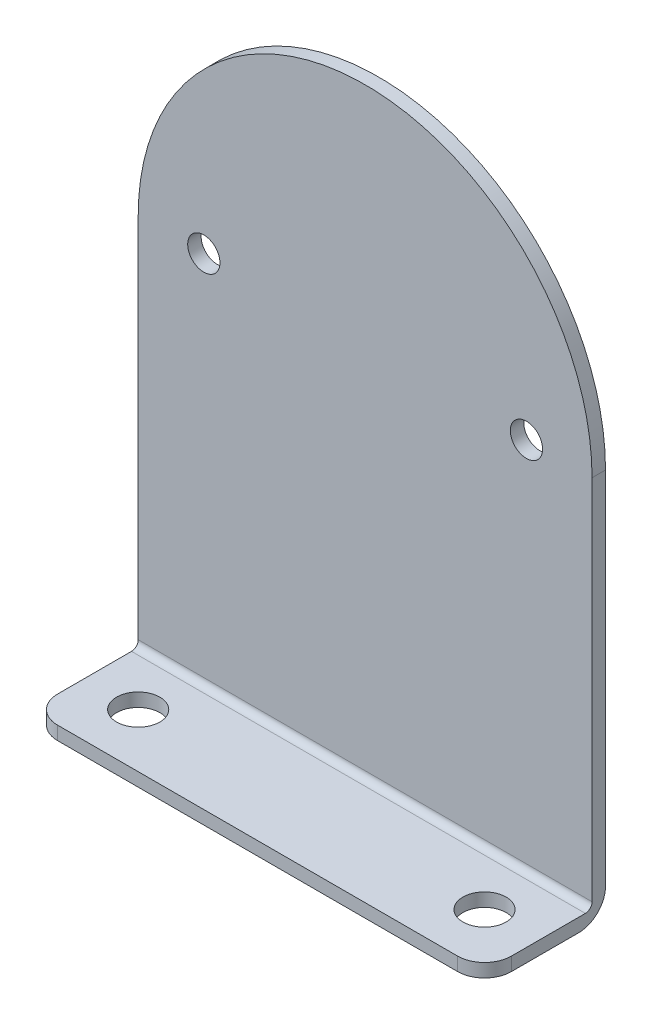
ISO-10303-21;
HEADER;
FILE_DESCRIPTION(('STEP AP214'),'2;1');
FILE_NAME('part.step','',(''),(''),'','','');
FILE_SCHEMA(('AUTOMOTIVE_DESIGN { 1 0 10303 214 1 1 1 1 }'));
ENDSEC;
DATA;
#1=APPLICATION_CONTEXT('core data for automotive mechanical design processes');
#2=APPLICATION_PROTOCOL_DEFINITION('international standard','automotive_design',2000,#1);
#3=PRODUCT_CONTEXT('',#1,'mechanical');
#4=PRODUCT('Part','Part','',(#3));
#5=PRODUCT_RELATED_PRODUCT_CATEGORY('part','',(#4));
#6=PRODUCT_DEFINITION_FORMATION('','',#4);
#7=PRODUCT_DEFINITION_CONTEXT('part definition',#1,'design');
#8=PRODUCT_DEFINITION('design','',#6,#7);
#9=PRODUCT_DEFINITION_SHAPE('','',#8);
#10=(LENGTH_UNIT() NAMED_UNIT(*) SI_UNIT(.MILLI.,.METRE.));
#11=(NAMED_UNIT(*) PLANE_ANGLE_UNIT() SI_UNIT($,.RADIAN.));
#12=(NAMED_UNIT(*) SI_UNIT($,.STERADIAN.) SOLID_ANGLE_UNIT());
#13=UNCERTAINTY_MEASURE_WITH_UNIT(LENGTH_MEASURE(1.E-05),#10,'distance_accuracy_value','');
#14=(GEOMETRIC_REPRESENTATION_CONTEXT(3) GLOBAL_UNCERTAINTY_ASSIGNED_CONTEXT((#13)) GLOBAL_UNIT_ASSIGNED_CONTEXT((#10,
#11,#12)) REPRESENTATION_CONTEXT('',''));
#15=CARTESIAN_POINT('',(0.,0.,0.));
#16=DIRECTION('',(0.,0.,1.));
#17=DIRECTION('',(1.,0.,0.));
#18=AXIS2_PLACEMENT_3D('',#15,#16,#17);
#19=CARTESIAN_POINT('',(-23.622,-45.348525,11.1125));
#20=DIRECTION('',(0.,1.,0.));
#21=DIRECTION('',(0.,0.,1.));
#22=AXIS2_PLACEMENT_3D('',#19,#20,#21);
#23=CYLINDRICAL_SURFACE('',#22,3.175);
#24=CARTESIAN_POINT('',(-23.622,-45.7454,11.1125));
#25=DIRECTION('',(0.,1.,0.));
#26=DIRECTION('',(0.,0.,1.));
#27=AXIS2_PLACEMENT_3D('',#24,#25,#26);
#28=CIRCLE('',#27,3.175);
#29=CARTESIAN_POINT('',(-23.622,-45.7454,14.2875));
#30=VERTEX_POINT('',#29);
#31=CARTESIAN_POINT('',(-26.797,-45.7454,11.1125));
#32=VERTEX_POINT('',#31);
#33=EDGE_CURVE('E141',#30,#32,#28,.F.);
#34=ORIENTED_EDGE('',*,*,#33,.F.);
#35=DIRECTION('',(0.,-1.,0.));
#36=VECTOR('',#35,1.);
#37=CARTESIAN_POINT('',(-23.622,-44.95165,14.2875));
#38=LINE('',#37,#36);
#39=CARTESIAN_POINT('',(-23.622,-44.1579,14.2875));
#40=VERTEX_POINT('',#39);
#41=EDGE_CURVE('E104',#40,#30,#38,.T.);
#42=ORIENTED_EDGE('',*,*,#41,.F.);
#43=CARTESIAN_POINT('',(-23.622,-44.1579,11.1125));
#44=DIRECTION('',(0.,1.,0.));
#45=DIRECTION('',(0.,0.,1.));
#46=AXIS2_PLACEMENT_3D('',#43,#44,#45);
#47=CIRCLE('',#46,3.175);
#48=CARTESIAN_POINT('',(-26.797,-44.1579,11.1125));
#49=VERTEX_POINT('',#48);
#50=EDGE_CURVE('E139',#49,#40,#47,.T.);
#51=ORIENTED_EDGE('',*,*,#50,.F.);
#52=DIRECTION('',(0.,1.,0.));
#53=VECTOR('',#52,1.);
#54=CARTESIAN_POINT('',(-26.797,-45.348525,11.1125));
#55=LINE('',#54,#53);
#56=EDGE_CURVE('E145',#49,#32,#55,.F.);
#57=ORIENTED_EDGE('',*,*,#56,.T.);
#58=EDGE_LOOP('',(#34,#42,#51,#57));
#59=FACE_BOUND('',#58,.T.);
#60=ADVANCED_FACE('F17',(#59),#23,.T.);
#61=CARTESIAN_POINT('',(-1.76456071976361E-13,-44.95165,14.2875));
#62=DIRECTION('',(0.,0.,1.));
#63=DIRECTION('',(0.,-1.,0.));
#64=AXIS2_PLACEMENT_3D('',#61,#62,#63);
#65=PLANE('',#64);
#66=ORIENTED_EDGE('',*,*,#41,.T.);
#67=DIRECTION('',(1.,0.,0.));
#68=VECTOR('',#67,1.);
#69=CARTESIAN_POINT('',(26.7969999999997,-45.7454,14.2875));
#70=LINE('',#69,#68);
#71=CARTESIAN_POINT('',(23.6219999999997,-45.7454,14.2875));
#72=VERTEX_POINT('',#71);
#73=EDGE_CURVE('E112',#72,#30,#70,.F.);
#74=ORIENTED_EDGE('',*,*,#73,.F.);
#75=DIRECTION('',(0.,-1.,0.));
#76=VECTOR('',#75,1.);
#77=CARTESIAN_POINT('',(23.6219999999997,-22.4758250000001,14.2875));
#78=LINE('',#77,#76);
#79=CARTESIAN_POINT('',(23.6219999999997,-44.1579,14.2875));
#80=VERTEX_POINT('',#79);
#81=EDGE_CURVE('E103',#80,#72,#78,.T.);
#82=ORIENTED_EDGE('',*,*,#81,.F.);
#83=DIRECTION('',(1.,0.,0.));
#84=VECTOR('',#83,1.);
#85=CARTESIAN_POINT('',(-26.797,-44.1579,14.2875));
#86=LINE('',#85,#84);
#87=EDGE_CURVE('E135',#40,#80,#86,.T.);
#88=ORIENTED_EDGE('',*,*,#87,.F.);
#89=EDGE_LOOP('',(#66,#74,#82,#88));
#90=FACE_BOUND('',#89,.T.);
#91=ADVANCED_FACE('F223',(#90),#65,.T.);
#92=CARTESIAN_POINT('',(23.6219999999997,-22.4758250000001,11.1125));
#93=DIRECTION('',(0.,-1.,0.));
#94=DIRECTION('',(0.,0.,-1.));
#95=AXIS2_PLACEMENT_3D('',#92,#93,#94);
#96=CYLINDRICAL_SURFACE('',#95,3.175);
#97=CARTESIAN_POINT('',(23.6219999999997,-44.1579,11.1125));
#98=DIRECTION('',(0.,-1.,0.));
#99=DIRECTION('',(0.,0.,-1.));
#100=AXIS2_PLACEMENT_3D('',#97,#98,#99);
#101=CIRCLE('',#100,3.175);
#102=CARTESIAN_POINT('',(26.7969999999997,-44.1579,11.1125));
#103=VERTEX_POINT('',#102);
#104=EDGE_CURVE('E138',#80,#103,#101,.F.);
#105=ORIENTED_EDGE('',*,*,#104,.F.);
#106=ORIENTED_EDGE('',*,*,#81,.T.);
#107=CARTESIAN_POINT('',(23.6219999999997,-45.7454,11.1125));
#108=DIRECTION('',(0.,-1.,0.));
#109=DIRECTION('',(0.,0.,-1.));
#110=AXIS2_PLACEMENT_3D('',#107,#108,#109);
#111=CIRCLE('',#110,3.175);
#112=CARTESIAN_POINT('',(26.7969999999997,-45.7454,11.1125));
#113=VERTEX_POINT('',#112);
#114=EDGE_CURVE('E20',#113,#72,#111,.T.);
#115=ORIENTED_EDGE('',*,*,#114,.F.);
#116=DIRECTION('',(0.,-1.,0.));
#117=VECTOR('',#116,1.);
#118=CARTESIAN_POINT('',(26.7969999999997,-22.4758250000001,11.1125));
#119=LINE('',#118,#117);
#120=EDGE_CURVE('E91',#113,#103,#119,.F.);
#121=ORIENTED_EDGE('',*,*,#120,.T.);
#122=EDGE_LOOP('',(#105,#106,#115,#121));
#123=FACE_BOUND('',#122,.T.);
#124=ADVANCED_FACE('F108',(#123),#96,.T.);
#125=CARTESIAN_POINT('',(20.4469999999997,-135.475200058696,7.9375));
#126=DIRECTION('',(0.,1.,0.));
#127=DIRECTION('',(0.,0.,1.));
#128=AXIS2_PLACEMENT_3D('',#125,#126,#127);
#129=CYLINDRICAL_SURFACE('',#128,2.5527);
#130=CARTESIAN_POINT('',(20.4469999999997,-44.1579,7.9375));
#131=DIRECTION('',(0.,1.,0.));
#132=DIRECTION('',(0.,0.,1.));
#133=AXIS2_PLACEMENT_3D('',#130,#131,#132);
#134=CIRCLE('',#133,2.5527);
#135=CARTESIAN_POINT('',(20.4469999999997,-44.1579,10.4902));
#136=VERTEX_POINT('',#135);
#137=EDGE_CURVE('E175',#136,#136,#134,.F.);
#138=ORIENTED_EDGE('',*,*,#137,.F.);
#139=EDGE_LOOP('',(#138));
#140=FACE_BOUND('',#139,.T.);
#141=CARTESIAN_POINT('',(20.4469999999997,-45.7454,7.9375));
#142=DIRECTION('',(0.,1.,0.));
#143=DIRECTION('',(0.,0.,1.));
#144=AXIS2_PLACEMENT_3D('',#141,#142,#143);
#145=CIRCLE('',#144,2.5527);
#146=CARTESIAN_POINT('',(20.4469999999997,-45.7454,10.4902));
#147=VERTEX_POINT('',#146);
#148=EDGE_CURVE('E181',#147,#147,#145,.T.);
#149=ORIENTED_EDGE('',*,*,#148,.F.);
#150=EDGE_LOOP('',(#149));
#151=FACE_BOUND('',#150,.T.);
#152=ADVANCED_FACE('F266',(#140,#151),#129,.F.);
#153=CARTESIAN_POINT('',(-20.447,-135.475200058696,7.9375));
#154=DIRECTION('',(0.,1.,0.));
#155=DIRECTION('',(0.,0.,1.));
#156=AXIS2_PLACEMENT_3D('',#153,#154,#155);
#157=CYLINDRICAL_SURFACE('',#156,2.5527);
#158=CARTESIAN_POINT('',(-20.447,-44.1579,7.9375));
#159=DIRECTION('',(0.,1.,0.));
#160=DIRECTION('',(0.,0.,1.));
#161=AXIS2_PLACEMENT_3D('',#158,#159,#160);
#162=CIRCLE('',#161,2.5527);
#163=CARTESIAN_POINT('',(-20.447,-44.1579,10.4902));
#164=VERTEX_POINT('',#163);
#165=EDGE_CURVE('E133',#164,#164,#162,.F.);
#166=ORIENTED_EDGE('',*,*,#165,.F.);
#167=EDGE_LOOP('',(#166));
#168=FACE_BOUND('',#167,.T.);
#169=CARTESIAN_POINT('',(-20.447,-45.7454,7.9375));
#170=DIRECTION('',(0.,1.,0.));
#171=DIRECTION('',(0.,0.,1.));
#172=AXIS2_PLACEMENT_3D('',#169,#170,#171);
#173=CIRCLE('',#172,2.5527);
#174=CARTESIAN_POINT('',(-20.447,-45.7454,10.4902));
#175=VERTEX_POINT('',#174);
#176=EDGE_CURVE('E184',#175,#175,#173,.T.);
#177=ORIENTED_EDGE('',*,*,#176,.F.);
#178=EDGE_LOOP('',(#177));
#179=FACE_BOUND('',#178,.T.);
#180=ADVANCED_FACE('F263',(#168,#179),#157,.F.);
#181=CARTESIAN_POINT('',(13.3984999999997,-42.5704,3.175));
#182=DIRECTION('',(1.,0.,0.));
#183=DIRECTION('',(0.,0.,-1.));
#184=AXIS2_PLACEMENT_3D('',#181,#182,#183);
#185=CYLINDRICAL_SURFACE('',#184,3.175);
#186=CARTESIAN_POINT('',(-26.797,-42.5704,3.175));
#187=DIRECTION('',(1.,0.,0.));
#188=DIRECTION('',(0.,0.,-1.));
#189=AXIS2_PLACEMENT_3D('',#186,#187,#188);
#190=CIRCLE('',#189,3.175);
#191=CARTESIAN_POINT('',(-26.797,-42.5704,0.));
#192=VERTEX_POINT('',#191);
#193=CARTESIAN_POINT('',(-26.797,-45.7454,3.175));
#194=VERTEX_POINT('',#193);
#195=EDGE_CURVE('E166',#192,#194,#190,.F.);
#196=ORIENTED_EDGE('',*,*,#195,.F.);
#197=DIRECTION('',(1.,0.,0.));
#198=VECTOR('',#197,1.);
#199=CARTESIAN_POINT('',(-1.75415237890775E-13,-42.5704,0.));
#200=LINE('',#199,#198);
#201=CARTESIAN_POINT('',(26.7969999999997,-42.5704,0.));
#202=VERTEX_POINT('',#201);
#203=EDGE_CURVE('E130',#192,#202,#200,.T.);
#204=ORIENTED_EDGE('',*,*,#203,.T.);
#205=CARTESIAN_POINT('',(26.7969999999997,-42.5704,3.175));
#206=DIRECTION('',(1.,0.,0.));
#207=DIRECTION('',(0.,0.,-1.));
#208=AXIS2_PLACEMENT_3D('',#205,#206,#207);
#209=CIRCLE('',#208,3.175);
#210=CARTESIAN_POINT('',(26.7969999999997,-45.7454,3.175));
#211=VERTEX_POINT('',#210);
#212=EDGE_CURVE('E129',#211,#202,#209,.T.);
#213=ORIENTED_EDGE('',*,*,#212,.F.);
#214=DIRECTION('',(1.,0.,0.));
#215=VECTOR('',#214,1.);
#216=CARTESIAN_POINT('',(26.7969999999997,-45.7454,3.175));
#217=LINE('',#216,#215);
#218=EDGE_CURVE('E113',#194,#211,#217,.T.);
#219=ORIENTED_EDGE('',*,*,#218,.F.);
#220=EDGE_LOOP('',(#196,#204,#213,#219));
#221=FACE_BOUND('',#220,.T.);
#222=ADVANCED_FACE('F212',(#221),#185,.T.);
#223=CARTESIAN_POINT('',(26.7969999999997,-45.7454,0.));
#224=DIRECTION('',(0.,-1.,0.));
#225=DIRECTION('',(0.,0.,-1.));
#226=AXIS2_PLACEMENT_3D('',#223,#224,#225);
#227=PLANE('',#226);
#228=ORIENTED_EDGE('',*,*,#148,.T.);
#229=EDGE_LOOP('',(#228));
#230=FACE_BOUND('',#229,.T.);
#231=ORIENTED_EDGE('',*,*,#176,.T.);
#232=EDGE_LOOP('',(#231));
#233=FACE_BOUND('',#232,.T.);
#234=ORIENTED_EDGE('',*,*,#33,.T.);
#235=DIRECTION('',(0.,0.,1.));
#236=VECTOR('',#235,1.);
#237=CARTESIAN_POINT('',(-26.797,-45.7454,0.));
#238=LINE('',#237,#236);
#239=EDGE_CURVE('E169',#194,#32,#238,.T.);
#240=ORIENTED_EDGE('',*,*,#239,.F.);
#241=ORIENTED_EDGE('',*,*,#218,.T.);
#242=DIRECTION('',(0.,0.,-1.));
#243=VECTOR('',#242,1.);
#244=CARTESIAN_POINT('',(26.7969999999997,-45.7454,0.));
#245=LINE('',#244,#243);
#246=EDGE_CURVE('E96',#113,#211,#245,.T.);
#247=ORIENTED_EDGE('',*,*,#246,.F.);
#248=ORIENTED_EDGE('',*,*,#114,.T.);
#249=ORIENTED_EDGE('',*,*,#73,.T.);
#250=EDGE_LOOP('',(#234,#240,#241,#247,#248,#249));
#251=FACE_BOUND('',#250,.T.);
#252=ADVANCED_FACE('F116',(#230,#233,#251),#227,.T.);
#253=CARTESIAN_POINT('',(-26.797,-44.1579,1.5875));
#254=DIRECTION('',(0.,1.,0.));
#255=DIRECTION('',(0.,0.,1.));
#256=AXIS2_PLACEMENT_3D('',#253,#254,#255);
#257=PLANE('',#256);
#258=ORIENTED_EDGE('',*,*,#165,.T.);
#259=EDGE_LOOP('',(#258));
#260=FACE_BOUND('',#259,.T.);
#261=ORIENTED_EDGE('',*,*,#137,.T.);
#262=EDGE_LOOP('',(#261));
#263=FACE_BOUND('',#262,.T.);
#264=ORIENTED_EDGE('',*,*,#104,.T.);
#265=DIRECTION('',(0.,0.,-1.));
#266=VECTOR('',#265,1.);
#267=CARTESIAN_POINT('',(26.7969999999997,-44.1579,0.));
#268=LINE('',#267,#266);
#269=CARTESIAN_POINT('',(26.7969999999997,-44.1579,2.38125));
#270=VERTEX_POINT('',#269);
#271=EDGE_CURVE('E99',#270,#103,#268,.F.);
#272=ORIENTED_EDGE('',*,*,#271,.F.);
#273=DIRECTION('',(1.,0.,0.));
#274=VECTOR('',#273,1.);
#275=CARTESIAN_POINT('',(-13.3985000000001,-44.1579,2.38125));
#276=LINE('',#275,#274);
#277=CARTESIAN_POINT('',(-26.797,-44.1579,2.38125));
#278=VERTEX_POINT('',#277);
#279=EDGE_CURVE('E132',#270,#278,#276,.F.);
#280=ORIENTED_EDGE('',*,*,#279,.T.);
#281=DIRECTION('',(0.,0.,1.));
#282=VECTOR('',#281,1.);
#283=CARTESIAN_POINT('',(-26.797,-44.1579,0.));
#284=LINE('',#283,#282);
#285=EDGE_CURVE('E165',#49,#278,#284,.F.);
#286=ORIENTED_EDGE('',*,*,#285,.F.);
#287=ORIENTED_EDGE('',*,*,#50,.T.);
#288=ORIENTED_EDGE('',*,*,#87,.T.);
#289=EDGE_LOOP('',(#264,#272,#280,#286,#287,#288));
#290=FACE_BOUND('',#289,.T.);
#291=ADVANCED_FACE('F220',(#260,#263,#290),#257,.T.);
#292=CARTESIAN_POINT('',(-1.75415237890775E-13,-25.4684949706684,0.));
#293=DIRECTION('',(0.,0.,1.));
#294=DIRECTION('',(1.,0.,0.));
#295=AXIS2_PLACEMENT_3D('',#292,#293,#294);
#296=PLANE('',#295);
#297=CARTESIAN_POINT('',(-19.0500000000002,-1.25455201782643E-13,0.));
#298=DIRECTION('',(0.,0.,1.));
#299=DIRECTION('',(1.,0.,0.));
#300=AXIS2_PLACEMENT_3D('',#297,#298,#299);
#301=CIRCLE('',#300,1.905);
#302=CARTESIAN_POINT('',(-17.1450000000002,-1.25455201782643E-13,0.));
#303=VERTEX_POINT('',#302);
#304=EDGE_CURVE('E154',#303,#303,#301,.T.);
#305=ORIENTED_EDGE('',*,*,#304,.T.);
#306=EDGE_LOOP('',(#305));
#307=FACE_BOUND('',#306,.T.);
#308=CARTESIAN_POINT('',(19.0499999999998,-1.25455201782643E-13,0.));
#309=DIRECTION('',(0.,0.,1.));
#310=DIRECTION('',(1.,0.,0.));
#311=AXIS2_PLACEMENT_3D('',#308,#309,#310);
#312=CIRCLE('',#311,1.905);
#313=CARTESIAN_POINT('',(20.9549999999998,-1.25455201782643E-13,0.));
#314=VERTEX_POINT('',#313);
#315=EDGE_CURVE('E158',#314,#314,#312,.T.);
#316=ORIENTED_EDGE('',*,*,#315,.T.);
#317=EDGE_LOOP('',(#316));
#318=FACE_BOUND('',#317,.T.);
#319=DIRECTION('',(0.,1.,0.));
#320=VECTOR('',#319,1.);
#321=CARTESIAN_POINT('',(-26.797,-45.7454,0.));
#322=LINE('',#321,#320);
#323=CARTESIAN_POINT('',(-26.797,-1.25177646026486E-13,0.));
#324=VERTEX_POINT('',#323);
#325=EDGE_CURVE('E161',#324,#192,#322,.F.);
#326=ORIENTED_EDGE('',*,*,#325,.F.);
#327=CARTESIAN_POINT('',(-1.73194791841524E-13,-1.25455201782643E-13,0.));
#328=DIRECTION('',(0.,0.,1.));
#329=DIRECTION('',(1.,0.,0.));
#330=AXIS2_PLACEMENT_3D('',#327,#328,#329);
#331=CIRCLE('',#330,26.7969999999997);
#332=CARTESIAN_POINT('',(26.7969999999997,-1.25455201782643E-13,0.));
#333=VERTEX_POINT('',#332);
#334=EDGE_CURVE('E121',#333,#324,#331,.T.);
#335=ORIENTED_EDGE('',*,*,#334,.F.);
#336=DIRECTION('',(0.,1.,0.));
#337=VECTOR('',#336,1.);
#338=CARTESIAN_POINT('',(26.7969999999997,-1.25455201782643E-13,0.));
#339=LINE('',#338,#337);
#340=EDGE_CURVE('E127',#202,#333,#339,.T.);
#341=ORIENTED_EDGE('',*,*,#340,.F.);
#342=ORIENTED_EDGE('',*,*,#203,.F.);
#343=EDGE_LOOP('',(#326,#335,#341,#342));
#344=FACE_BOUND('',#343,.T.);
#345=ADVANCED_FACE('F209',(#307,#318,#344),#296,.F.);
#346=CARTESIAN_POINT('',(-13.3985000000001,-43.36415,2.38125));
#347=DIRECTION('',(1.,0.,0.));
#348=DIRECTION('',(0.,0.,-1.));
#349=AXIS2_PLACEMENT_3D('',#346,#347,#348);
#350=CYLINDRICAL_SURFACE('',#349,0.79375);
#351=ORIENTED_EDGE('',*,*,#279,.F.);
#352=CARTESIAN_POINT('',(26.7969999999997,-43.36415,2.38125));
#353=DIRECTION('',(1.,0.,0.));
#354=DIRECTION('',(0.,0.,-1.));
#355=AXIS2_PLACEMENT_3D('',#352,#353,#354);
#356=CIRCLE('',#355,0.79375);
#357=CARTESIAN_POINT('',(26.7969999999997,-43.36415,1.5875));
#358=VERTEX_POINT('',#357);
#359=EDGE_CURVE('E123',#358,#270,#356,.F.);
#360=ORIENTED_EDGE('',*,*,#359,.F.);
#361=DIRECTION('',(1.,0.,0.));
#362=VECTOR('',#361,1.);
#363=CARTESIAN_POINT('',(-1.75415237890775E-13,-43.36415,1.5875));
#364=LINE('',#363,#362);
#365=CARTESIAN_POINT('',(-26.797,-43.36415,1.5875));
#366=VERTEX_POINT('',#365);
#367=EDGE_CURVE('E157',#366,#358,#364,.T.);
#368=ORIENTED_EDGE('',*,*,#367,.F.);
#369=CARTESIAN_POINT('',(-26.797,-43.36415,2.38125));
#370=DIRECTION('',(1.,0.,0.));
#371=DIRECTION('',(0.,0.,-1.));
#372=AXIS2_PLACEMENT_3D('',#369,#370,#371);
#373=CIRCLE('',#372,0.79375);
#374=EDGE_CURVE('E162',#278,#366,#373,.T.);
#375=ORIENTED_EDGE('',*,*,#374,.F.);
#376=EDGE_LOOP('',(#351,#360,#368,#375));
#377=FACE_BOUND('',#376,.T.);
#378=ADVANCED_FACE('F218',(#377),#350,.F.);
#379=CARTESIAN_POINT('',(26.7969999999997,-1.25455201782643E-13,0.));
#380=DIRECTION('',(1.,0.,0.));
#381=DIRECTION('',(0.,0.,-1.));
#382=AXIS2_PLACEMENT_3D('',#379,#380,#381);
#383=PLANE('',#382);
#384=ORIENTED_EDGE('',*,*,#120,.F.);
#385=ORIENTED_EDGE('',*,*,#246,.T.);
#386=ORIENTED_EDGE('',*,*,#212,.T.);
#387=ORIENTED_EDGE('',*,*,#340,.T.);
#388=DIRECTION('',(0.,0.,1.));
#389=VECTOR('',#388,1.);
#390=CARTESIAN_POINT('',(26.7969999999996,-1.25455201782643E-13,0.));
#391=LINE('',#390,#389);
#392=CARTESIAN_POINT('',(26.7969999999997,-1.25455201782643E-13,1.5875));
#393=VERTEX_POINT('',#392);
#394=EDGE_CURVE('E118',#393,#333,#391,.F.);
#395=ORIENTED_EDGE('',*,*,#394,.F.);
#396=DIRECTION('',(0.,1.,0.));
#397=VECTOR('',#396,1.);
#398=CARTESIAN_POINT('',(26.7969999999997,-25.4684949706684,1.5875));
#399=LINE('',#398,#397);
#400=EDGE_CURVE('E153',#358,#393,#399,.T.);
#401=ORIENTED_EDGE('',*,*,#400,.F.);
#402=ORIENTED_EDGE('',*,*,#359,.T.);
#403=ORIENTED_EDGE('',*,*,#271,.T.);
#404=EDGE_LOOP('',(#384,#385,#386,#387,#395,#401,#402,#403));
#405=FACE_BOUND('',#404,.T.);
#406=ADVANCED_FACE('F93',(#405),#383,.T.);
#407=CARTESIAN_POINT('',(-1.73194791841524E-13,-1.25455201782643E-13,0.));
#408=DIRECTION('',(0.,0.,1.));
#409=DIRECTION('',(1.,0.,0.));
#410=AXIS2_PLACEMENT_3D('',#407,#408,#409);
#411=CYLINDRICAL_SURFACE('',#410,26.7969999999997);
#412=ORIENTED_EDGE('',*,*,#394,.T.);
#413=ORIENTED_EDGE('',*,*,#334,.T.);
#414=DIRECTION('',(0.,0.,1.));
#415=VECTOR('',#414,1.);
#416=CARTESIAN_POINT('',(-26.797,-1.2490009027033E-13,0.));
#417=LINE('',#416,#415);
#418=CARTESIAN_POINT('',(-26.797,-1.25177646026486E-13,1.5875));
#419=VERTEX_POINT('',#418);
#420=EDGE_CURVE('E35',#419,#324,#417,.F.);
#421=ORIENTED_EDGE('',*,*,#420,.F.);
#422=CARTESIAN_POINT('',(-1.73194791841524E-13,-1.25455201782643E-13,1.5875));
#423=DIRECTION('',(0.,0.,1.));
#424=DIRECTION('',(1.,0.,0.));
#425=AXIS2_PLACEMENT_3D('',#422,#423,#424);
#426=CIRCLE('',#425,26.7969999999997);
#427=EDGE_CURVE('E150',#393,#419,#426,.T.);
#428=ORIENTED_EDGE('',*,*,#427,.F.);
#429=EDGE_LOOP('',(#412,#413,#421,#428));
#430=FACE_BOUND('',#429,.T.);
#431=ADVANCED_FACE('F213',(#430),#411,.T.);
#432=CARTESIAN_POINT('',(-26.797,-45.7454,0.));
#433=DIRECTION('',(-1.,0.,0.));
#434=DIRECTION('',(0.,0.,1.));
#435=AXIS2_PLACEMENT_3D('',#432,#433,#434);
#436=PLANE('',#435);
#437=ORIENTED_EDGE('',*,*,#420,.T.);
#438=ORIENTED_EDGE('',*,*,#325,.T.);
#439=ORIENTED_EDGE('',*,*,#195,.T.);
#440=ORIENTED_EDGE('',*,*,#239,.T.);
#441=ORIENTED_EDGE('',*,*,#56,.F.);
#442=ORIENTED_EDGE('',*,*,#285,.T.);
#443=ORIENTED_EDGE('',*,*,#374,.T.);
#444=DIRECTION('',(0.,1.,0.));
#445=VECTOR('',#444,1.);
#446=CARTESIAN_POINT('',(-26.797,-25.4684949706684,1.5875));
#447=LINE('',#446,#445);
#448=EDGE_CURVE('E149',#419,#366,#447,.F.);
#449=ORIENTED_EDGE('',*,*,#448,.F.);
#450=EDGE_LOOP('',(#437,#438,#439,#440,#441,#442,#443,#449));
#451=FACE_BOUND('',#450,.T.);
#452=ADVANCED_FACE('F190',(#451),#436,.T.);
#453=CARTESIAN_POINT('',(19.0499999999998,-1.25455201782643E-13,-89.729800058696));
#454=DIRECTION('',(0.,0.,1.));
#455=DIRECTION('',(1.,0.,0.));
#456=AXIS2_PLACEMENT_3D('',#453,#454,#455);
#457=CYLINDRICAL_SURFACE('',#456,1.905);
#458=CARTESIAN_POINT('',(19.0499999999998,-1.25455201782643E-13,1.58750000000001));
#459=DIRECTION('',(0.,0.,1.));
#460=DIRECTION('',(1.,0.,0.));
#461=AXIS2_PLACEMENT_3D('',#458,#459,#460);
#462=CIRCLE('',#461,1.905);
#463=CARTESIAN_POINT('',(20.9549999999998,-1.25455201782643E-13,1.58750000000001));
#464=VERTEX_POINT('',#463);
#465=EDGE_CURVE('E26',#464,#464,#462,.F.);
#466=ORIENTED_EDGE('',*,*,#465,.F.);
#467=EDGE_LOOP('',(#466));
#468=FACE_BOUND('',#467,.T.);
#469=ORIENTED_EDGE('',*,*,#315,.F.);
#470=EDGE_LOOP('',(#469));
#471=FACE_BOUND('',#470,.T.);
#472=ADVANCED_FACE('F236',(#468,#471),#457,.F.);
#473=CARTESIAN_POINT('',(-19.0500000000002,-1.25455201782643E-13,-89.729800058696));
#474=DIRECTION('',(0.,0.,1.));
#475=DIRECTION('',(1.,0.,0.));
#476=AXIS2_PLACEMENT_3D('',#473,#474,#475);
#477=CYLINDRICAL_SURFACE('',#476,1.905);
#478=CARTESIAN_POINT('',(-19.0500000000002,-1.25455201782643E-13,1.58750000000001));
#479=DIRECTION('',(0.,0.,1.));
#480=DIRECTION('',(1.,0.,0.));
#481=AXIS2_PLACEMENT_3D('',#478,#479,#480);
#482=CIRCLE('',#481,1.905);
#483=CARTESIAN_POINT('',(-17.1450000000002,-1.25455201782643E-13,1.58750000000001));
#484=VERTEX_POINT('',#483);
#485=EDGE_CURVE('E11',#484,#484,#482,.F.);
#486=ORIENTED_EDGE('',*,*,#485,.F.);
#487=EDGE_LOOP('',(#486));
#488=FACE_BOUND('',#487,.T.);
#489=ORIENTED_EDGE('',*,*,#304,.F.);
#490=EDGE_LOOP('',(#489));
#491=FACE_BOUND('',#490,.T.);
#492=ADVANCED_FACE('F230',(#488,#491),#477,.F.);
#493=CARTESIAN_POINT('',(-1.75415237890775E-13,-25.4684949706684,1.5875));
#494=DIRECTION('',(0.,0.,1.));
#495=DIRECTION('',(1.,0.,0.));
#496=AXIS2_PLACEMENT_3D('',#493,#494,#495);
#497=PLANE('',#496);
#498=ORIENTED_EDGE('',*,*,#485,.T.);
#499=EDGE_LOOP('',(#498));
#500=FACE_BOUND('',#499,.T.);
#501=ORIENTED_EDGE('',*,*,#465,.T.);
#502=EDGE_LOOP('',(#501));
#503=FACE_BOUND('',#502,.T.);
#504=ORIENTED_EDGE('',*,*,#427,.T.);
#505=ORIENTED_EDGE('',*,*,#448,.T.);
#506=ORIENTED_EDGE('',*,*,#367,.T.);
#507=ORIENTED_EDGE('',*,*,#400,.T.);
#508=EDGE_LOOP('',(#504,#505,#506,#507));
#509=FACE_BOUND('',#508,.T.);
#510=ADVANCED_FACE('F214',(#500,#503,#509),#497,.T.);
#511=CLOSED_SHELL('',(#60,#91,#124,#152,#180,#222,#252,#291,#345,#378,#406,#431,#452,#472,#492,#510));
#512=MANIFOLD_SOLID_BREP('B1',#511);
#513=ADVANCED_BREP_SHAPE_REPRESENTATION('',(#18,#512),#14);
#514=SHAPE_DEFINITION_REPRESENTATION(#9,#513);
ENDSEC;
END-ISO-10303-21;
